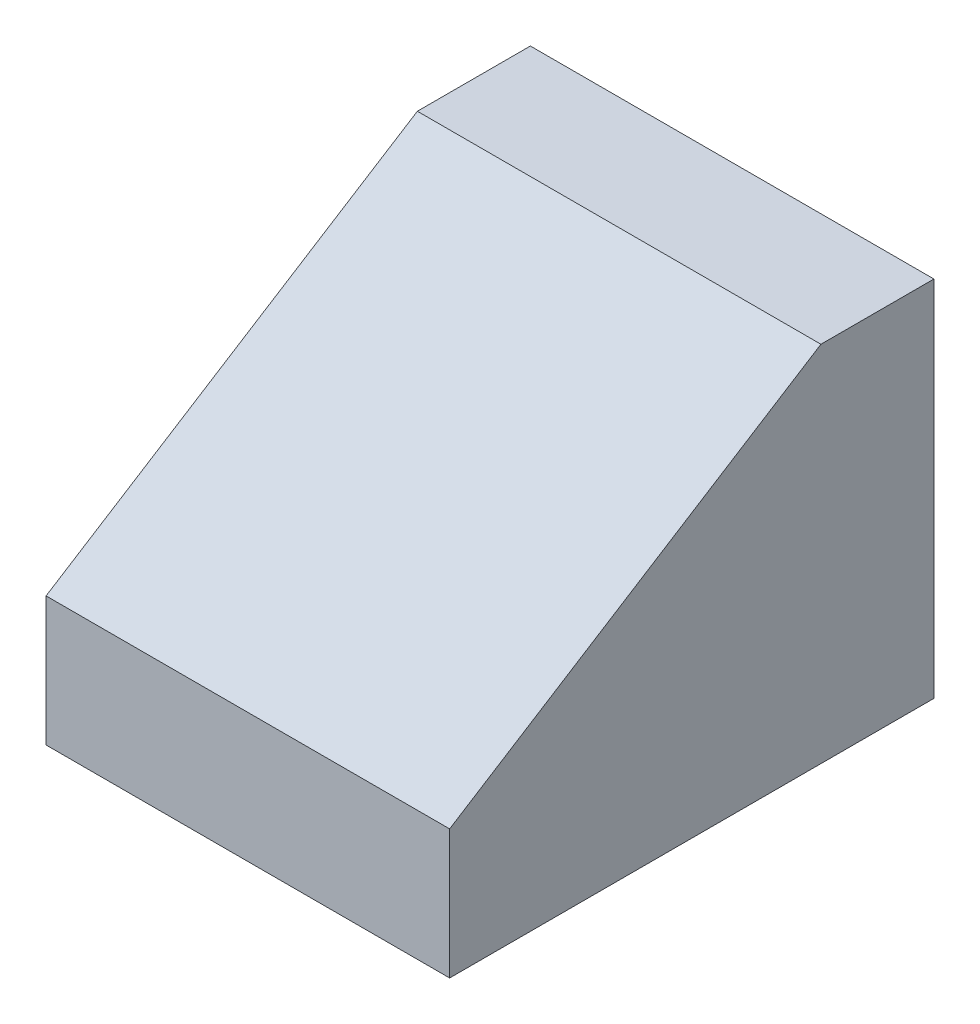
ISO-10303-21;
HEADER;
FILE_DESCRIPTION(('STEP AP214'),'2;1');
FILE_NAME('part.step','',(''),(''),'','','');
FILE_SCHEMA(('AUTOMOTIVE_DESIGN { 1 0 10303 214 1 1 1 1 }'));
ENDSEC;
DATA;
#1=APPLICATION_CONTEXT('core data for automotive mechanical design processes');
#2=APPLICATION_PROTOCOL_DEFINITION('international standard','automotive_design',2000,#1);
#3=PRODUCT_CONTEXT('',#1,'mechanical');
#4=PRODUCT('Part','Part','',(#3));
#5=PRODUCT_RELATED_PRODUCT_CATEGORY('part','',(#4));
#6=PRODUCT_DEFINITION_FORMATION('','',#4);
#7=PRODUCT_DEFINITION_CONTEXT('part definition',#1,'design');
#8=PRODUCT_DEFINITION('design','',#6,#7);
#9=PRODUCT_DEFINITION_SHAPE('','',#8);
#10=(LENGTH_UNIT() NAMED_UNIT(*) SI_UNIT(.MILLI.,.METRE.));
#11=(NAMED_UNIT(*) PLANE_ANGLE_UNIT() SI_UNIT($,.RADIAN.));
#12=(NAMED_UNIT(*) SI_UNIT($,.STERADIAN.) SOLID_ANGLE_UNIT());
#13=UNCERTAINTY_MEASURE_WITH_UNIT(LENGTH_MEASURE(1.E-05),#10,'distance_accuracy_value','');
#14=(GEOMETRIC_REPRESENTATION_CONTEXT(3) GLOBAL_UNCERTAINTY_ASSIGNED_CONTEXT((#13)) GLOBAL_UNIT_ASSIGNED_CONTEXT((#10,
#11,#12)) REPRESENTATION_CONTEXT('',''));
#15=CARTESIAN_POINT('',(0.,0.,0.));
#16=DIRECTION('',(0.,0.,1.));
#17=DIRECTION('',(1.,0.,0.));
#18=AXIS2_PLACEMENT_3D('',#15,#16,#17);
#19=CARTESIAN_POINT('',(50.,32.,49.2537313432836));
#20=DIRECTION('',(0.,0.,-1.));
#21=DIRECTION('',(0.,1.,0.));
#22=AXIS2_PLACEMENT_3D('',#19,#20,#21);
#23=PLANE('',#22);
#24=DIRECTION('',(0.,-1.,0.));
#25=VECTOR('',#24,1.);
#26=CARTESIAN_POINT('',(-50.,32.,49.2537313432836));
#27=LINE('',#26,#25);
#28=CARTESIAN_POINT('',(-50.,32.,49.2537313432836));
#29=VERTEX_POINT('',#28);
#30=CARTESIAN_POINT('',(-50.,0.,49.2537313432836));
#31=VERTEX_POINT('',#30);
#32=EDGE_CURVE('E107',#29,#31,#27,.T.);
#33=ORIENTED_EDGE('',*,*,#32,.T.);
#34=DIRECTION('',(-1.,0.,0.));
#35=VECTOR('',#34,1.);
#36=CARTESIAN_POINT('',(50.,0.,49.2537313432836));
#37=LINE('',#36,#35);
#38=CARTESIAN_POINT('',(50.,0.,49.2537313432836));
#39=VERTEX_POINT('',#38);
#40=EDGE_CURVE('E11',#39,#31,#37,.T.);
#41=ORIENTED_EDGE('',*,*,#40,.F.);
#42=DIRECTION('',(0.,-1.,0.));
#43=VECTOR('',#42,1.);
#44=CARTESIAN_POINT('',(50.,32.,49.2537313432836));
#45=LINE('',#44,#43);
#46=CARTESIAN_POINT('',(50.,32.,49.2537313432836));
#47=VERTEX_POINT('',#46);
#48=EDGE_CURVE('E115',#47,#39,#45,.T.);
#49=ORIENTED_EDGE('',*,*,#48,.F.);
#50=DIRECTION('',(-1.,0.,0.));
#51=VECTOR('',#50,1.);
#52=CARTESIAN_POINT('',(50.,32.,49.2537313432836));
#53=LINE('',#52,#51);
#54=EDGE_CURVE('E103',#47,#29,#53,.T.);
#55=ORIENTED_EDGE('',*,*,#54,.T.);
#56=EDGE_LOOP('',(#33,#41,#49,#55));
#57=FACE_BOUND('',#56,.T.);
#58=ADVANCED_FACE('F33',(#57),#23,.F.);
#59=CARTESIAN_POINT('',(50.,0.,49.2537313432836));
#60=DIRECTION('',(0.,1.,0.));
#61=DIRECTION('',(0.,0.,1.));
#62=AXIS2_PLACEMENT_3D('',#59,#60,#61);
#63=PLANE('',#62);
#64=DIRECTION('',(0.,0.,-1.));
#65=VECTOR('',#64,1.);
#66=CARTESIAN_POINT('',(-50.,0.,49.2537313432836));
#67=LINE('',#66,#65);
#68=CARTESIAN_POINT('',(-50.,0.,-70.7462686567164));
#69=VERTEX_POINT('',#68);
#70=EDGE_CURVE('E110',#31,#69,#67,.T.);
#71=ORIENTED_EDGE('',*,*,#70,.T.);
#72=DIRECTION('',(-1.,0.,0.));
#73=VECTOR('',#72,1.);
#74=CARTESIAN_POINT('',(50.,0.,-70.7462686567164));
#75=LINE('',#74,#73);
#76=CARTESIAN_POINT('',(50.,0.,-70.7462686567164));
#77=VERTEX_POINT('',#76);
#78=EDGE_CURVE('E41',#77,#69,#75,.T.);
#79=ORIENTED_EDGE('',*,*,#78,.F.);
#80=DIRECTION('',(0.,0.,-1.));
#81=VECTOR('',#80,1.);
#82=CARTESIAN_POINT('',(50.,0.,49.2537313432836));
#83=LINE('',#82,#81);
#84=EDGE_CURVE('E83',#39,#77,#83,.T.);
#85=ORIENTED_EDGE('',*,*,#84,.F.);
#86=ORIENTED_EDGE('',*,*,#40,.T.);
#87=EDGE_LOOP('',(#71,#79,#85,#86));
#88=FACE_BOUND('',#87,.T.);
#89=ADVANCED_FACE('F134',(#88),#63,.F.);
#90=CARTESIAN_POINT('',(50.,0.,-70.7462686567164));
#91=DIRECTION('',(0.,0.,1.));
#92=DIRECTION('',(1.,0.,0.));
#93=AXIS2_PLACEMENT_3D('',#90,#91,#92);
#94=PLANE('',#93);
#95=DIRECTION('',(0.,1.,0.));
#96=VECTOR('',#95,1.);
#97=CARTESIAN_POINT('',(-50.,0.,-70.7462686567164));
#98=LINE('',#97,#96);
#99=CARTESIAN_POINT('',(-50.,90.,-70.7462686567164));
#100=VERTEX_POINT('',#99);
#101=EDGE_CURVE('E98',#69,#100,#98,.T.);
#102=ORIENTED_EDGE('',*,*,#101,.T.);
#103=DIRECTION('',(-1.,0.,0.));
#104=VECTOR('',#103,1.);
#105=CARTESIAN_POINT('',(50.,90.,-70.7462686567164));
#106=LINE('',#105,#104);
#107=CARTESIAN_POINT('',(50.,90.,-70.7462686567164));
#108=VERTEX_POINT('',#107);
#109=EDGE_CURVE('E95',#108,#100,#106,.T.);
#110=ORIENTED_EDGE('',*,*,#109,.F.);
#111=DIRECTION('',(0.,1.,0.));
#112=VECTOR('',#111,1.);
#113=CARTESIAN_POINT('',(50.,0.,-70.7462686567164));
#114=LINE('',#113,#112);
#115=EDGE_CURVE('E87',#77,#108,#114,.T.);
#116=ORIENTED_EDGE('',*,*,#115,.F.);
#117=ORIENTED_EDGE('',*,*,#78,.T.);
#118=EDGE_LOOP('',(#102,#110,#116,#117));
#119=FACE_BOUND('',#118,.T.);
#120=ADVANCED_FACE('F96',(#119),#94,.F.);
#121=CARTESIAN_POINT('',(50.,90.,-70.7462686567164));
#122=DIRECTION('',(0.,-1.,0.));
#123=DIRECTION('',(0.,0.,-1.));
#124=AXIS2_PLACEMENT_3D('',#121,#122,#123);
#125=PLANE('',#124);
#126=DIRECTION('',(0.,0.,1.));
#127=VECTOR('',#126,1.);
#128=CARTESIAN_POINT('',(-50.,90.,-70.7462686567164));
#129=LINE('',#128,#127);
#130=CARTESIAN_POINT('',(-50.,90.,-42.7462686567164));
#131=VERTEX_POINT('',#130);
#132=EDGE_CURVE('E69',#100,#131,#129,.T.);
#133=ORIENTED_EDGE('',*,*,#132,.T.);
#134=DIRECTION('',(-1.,0.,0.));
#135=VECTOR('',#134,1.);
#136=CARTESIAN_POINT('',(50.,90.,-42.7462686567164));
#137=LINE('',#136,#135);
#138=CARTESIAN_POINT('',(50.,90.,-42.7462686567164));
#139=VERTEX_POINT('',#138);
#140=EDGE_CURVE('E99',#139,#131,#137,.T.);
#141=ORIENTED_EDGE('',*,*,#140,.F.);
#142=DIRECTION('',(0.,0.,1.));
#143=VECTOR('',#142,1.);
#144=CARTESIAN_POINT('',(50.,90.,-70.7462686567164));
#145=LINE('',#144,#143);
#146=EDGE_CURVE('E91',#108,#139,#145,.T.);
#147=ORIENTED_EDGE('',*,*,#146,.F.);
#148=ORIENTED_EDGE('',*,*,#109,.T.);
#149=EDGE_LOOP('',(#133,#141,#147,#148));
#150=FACE_BOUND('',#149,.T.);
#151=ADVANCED_FACE('F101',(#150),#125,.F.);
#152=CARTESIAN_POINT('',(50.,90.,-42.7462686567164));
#153=DIRECTION('',(0.,-0.845925602595653,-0.53330092337552));
#154=DIRECTION('',(0.,0.53330092337552,-0.845925602595653));
#155=AXIS2_PLACEMENT_3D('',#152,#153,#154);
#156=PLANE('',#155);
#157=DIRECTION('',(0.,-0.53330092337552,0.845925602595653));
#158=VECTOR('',#157,1.);
#159=CARTESIAN_POINT('',(-50.,90.,-42.7462686567164));
#160=LINE('',#159,#158);
#161=EDGE_CURVE('E75',#131,#29,#160,.T.);
#162=ORIENTED_EDGE('',*,*,#161,.T.);
#163=ORIENTED_EDGE('',*,*,#54,.F.);
#164=DIRECTION('',(0.,-0.53330092337552,0.845925602595653));
#165=VECTOR('',#164,1.);
#166=CARTESIAN_POINT('',(50.,90.,-42.7462686567164));
#167=LINE('',#166,#165);
#168=EDGE_CURVE('E49',#139,#47,#167,.T.);
#169=ORIENTED_EDGE('',*,*,#168,.F.);
#170=ORIENTED_EDGE('',*,*,#140,.T.);
#171=EDGE_LOOP('',(#162,#163,#169,#170));
#172=FACE_BOUND('',#171,.T.);
#173=ADVANCED_FACE('F123',(#172),#156,.F.);
#174=CARTESIAN_POINT('',(50.,0.,0.));
#175=DIRECTION('',(1.,0.,0.));
#176=DIRECTION('',(0.,0.,-1.));
#177=AXIS2_PLACEMENT_3D('',#174,#175,#176);
#178=PLANE('',#177);
#179=ORIENTED_EDGE('',*,*,#48,.T.);
#180=ORIENTED_EDGE('',*,*,#84,.T.);
#181=ORIENTED_EDGE('',*,*,#115,.T.);
#182=ORIENTED_EDGE('',*,*,#146,.T.);
#183=ORIENTED_EDGE('',*,*,#168,.T.);
#184=EDGE_LOOP('',(#179,#180,#181,#182,#183));
#185=FACE_BOUND('',#184,.T.);
#186=ADVANCED_FACE('F89',(#185),#178,.T.);
#187=CARTESIAN_POINT('',(-50.,0.,0.));
#188=DIRECTION('',(1.,0.,0.));
#189=DIRECTION('',(0.,0.,-1.));
#190=AXIS2_PLACEMENT_3D('',#187,#188,#189);
#191=PLANE('',#190);
#192=ORIENTED_EDGE('',*,*,#32,.F.);
#193=ORIENTED_EDGE('',*,*,#161,.F.);
#194=ORIENTED_EDGE('',*,*,#132,.F.);
#195=ORIENTED_EDGE('',*,*,#101,.F.);
#196=ORIENTED_EDGE('',*,*,#70,.F.);
#197=EDGE_LOOP('',(#192,#193,#194,#195,#196));
#198=FACE_BOUND('',#197,.T.);
#199=ADVANCED_FACE('F119',(#198),#191,.F.);
#200=CLOSED_SHELL('',(#58,#89,#120,#151,#173,#186,#199));
#201=MANIFOLD_SOLID_BREP('B2',#200);
#202=ADVANCED_BREP_SHAPE_REPRESENTATION('',(#18,#201),#14);
#203=SHAPE_DEFINITION_REPRESENTATION(#9,#202);
ENDSEC;
END-ISO-10303-21;
